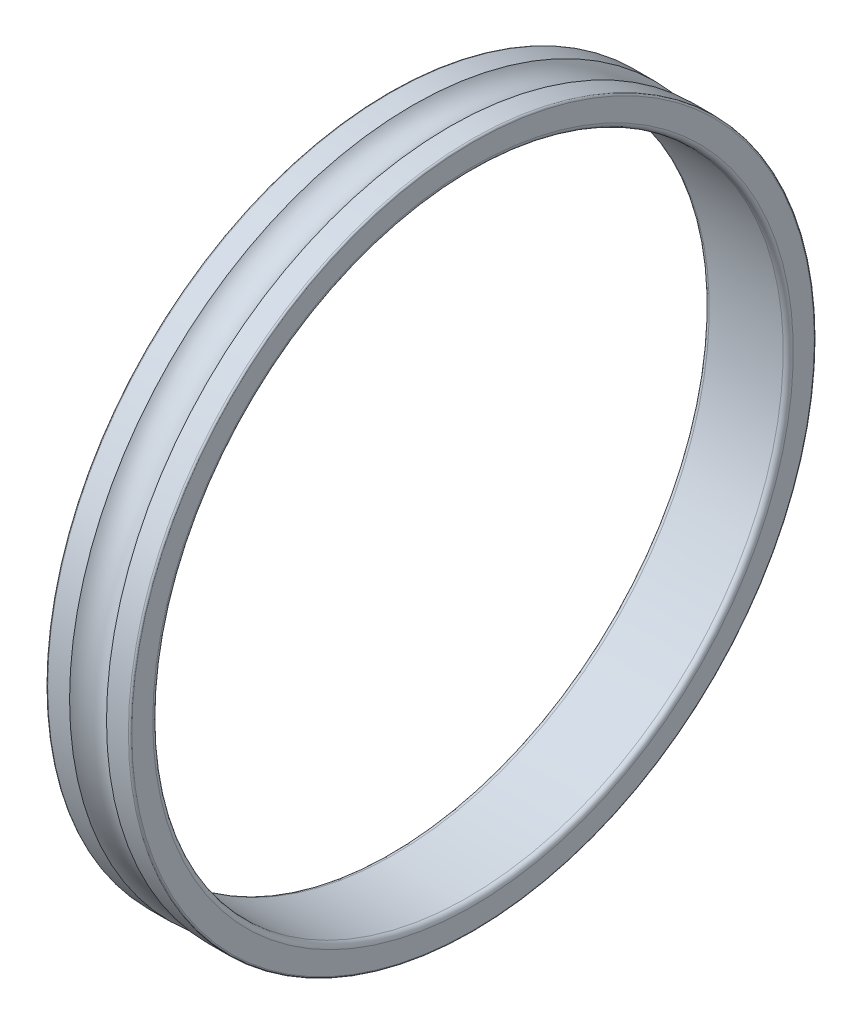
ISO-10303-21;
HEADER;
FILE_DESCRIPTION(('STEP AP214'),'2;1');
FILE_NAME('part.step','',(''),(''),'','','');
FILE_SCHEMA(('AUTOMOTIVE_DESIGN { 1 0 10303 214 1 1 1 1 }'));
ENDSEC;
DATA;
#1=APPLICATION_CONTEXT('core data for automotive mechanical design processes');
#2=APPLICATION_PROTOCOL_DEFINITION('international standard','automotive_design',2000,#1);
#3=PRODUCT_CONTEXT('',#1,'mechanical');
#4=PRODUCT('Part','Part','',(#3));
#5=PRODUCT_RELATED_PRODUCT_CATEGORY('part','',(#4));
#6=PRODUCT_DEFINITION_FORMATION('','',#4);
#7=PRODUCT_DEFINITION_CONTEXT('part definition',#1,'design');
#8=PRODUCT_DEFINITION('design','',#6,#7);
#9=PRODUCT_DEFINITION_SHAPE('','',#8);
#10=(LENGTH_UNIT() NAMED_UNIT(*) SI_UNIT(.MILLI.,.METRE.));
#11=(NAMED_UNIT(*) PLANE_ANGLE_UNIT() SI_UNIT($,.RADIAN.));
#12=(NAMED_UNIT(*) SI_UNIT($,.STERADIAN.) SOLID_ANGLE_UNIT());
#13=UNCERTAINTY_MEASURE_WITH_UNIT(LENGTH_MEASURE(1.E-05),#10,'distance_accuracy_value','');
#14=(GEOMETRIC_REPRESENTATION_CONTEXT(3) GLOBAL_UNCERTAINTY_ASSIGNED_CONTEXT((#13)) GLOBAL_UNIT_ASSIGNED_CONTEXT((#10,
#11,#12)) REPRESENTATION_CONTEXT('',''));
#15=CARTESIAN_POINT('',(0.,0.,0.));
#16=DIRECTION('',(0.,0.,1.));
#17=DIRECTION('',(1.,0.,0.));
#18=AXIS2_PLACEMENT_3D('',#15,#16,#17);
#19=CARTESIAN_POINT('',(0.,40.6,0.));
#20=DIRECTION('',(1.,0.,0.));
#21=DIRECTION('',(0.,0.,-1.));
#22=AXIS2_PLACEMENT_3D('',#19,#20,#21);
#23=PLANE('',#22);
#24=CARTESIAN_POINT('',(0.,0.,0.));
#25=DIRECTION('',(-1.,0.,0.));
#26=DIRECTION('',(0.,0.,1.));
#27=AXIS2_PLACEMENT_3D('',#24,#25,#26);
#28=CIRCLE('',#27,38.1);
#29=CARTESIAN_POINT('',(0.,0.,38.1));
#30=VERTEX_POINT('',#29);
#31=EDGE_CURVE('E9',#30,#30,#28,.T.);
#32=ORIENTED_EDGE('',*,*,#31,.F.);
#33=EDGE_LOOP('',(#32));
#34=FACE_BOUND('',#33,.T.);
#35=CARTESIAN_POINT('',(0.,0.,0.));
#36=DIRECTION('',(-1.,0.,0.));
#37=DIRECTION('',(0.,0.,1.));
#38=AXIS2_PLACEMENT_3D('',#35,#36,#37);
#39=CIRCLE('',#38,40.6);
#40=CARTESIAN_POINT('',(0.,0.,40.6));
#41=VERTEX_POINT('',#40);
#42=EDGE_CURVE('E47',#41,#41,#39,.T.);
#43=ORIENTED_EDGE('',*,*,#42,.T.);
#44=EDGE_LOOP('',(#43));
#45=FACE_BOUND('',#44,.T.);
#46=ADVANCED_FACE('F13',(#34,#45),#23,.F.);
#47=CARTESIAN_POINT('',(0.599999999999885,0.,0.));
#48=DIRECTION('',(-1.,0.,0.));
#49=DIRECTION('',(0.,0.,1.));
#50=AXIS2_PLACEMENT_3D('',#47,#48,#49);
#51=TOROIDAL_SURFACE('',#50,38.0999999999999,0.599999999999886);
#52=CARTESIAN_POINT('',(0.6,0.,0.));
#53=DIRECTION('',(-1.,0.,0.));
#54=DIRECTION('',(0.,0.,1.));
#55=AXIS2_PLACEMENT_3D('',#52,#53,#54);
#56=CIRCLE('',#55,37.5);
#57=CARTESIAN_POINT('',(0.6,0.,37.5));
#58=VERTEX_POINT('',#57);
#59=EDGE_CURVE('E19',#58,#58,#56,.T.);
#60=ORIENTED_EDGE('',*,*,#59,.F.);
#61=EDGE_LOOP('',(#60));
#62=FACE_BOUND('',#61,.T.);
#63=ORIENTED_EDGE('',*,*,#31,.T.);
#64=EDGE_LOOP('',(#63));
#65=FACE_BOUND('',#64,.T.);
#66=ADVANCED_FACE('F96',(#62,#65),#51,.T.);
#67=CARTESIAN_POINT('',(9.4,0.,0.));
#68=DIRECTION('',(-1.,0.,0.));
#69=DIRECTION('',(0.,0.,1.));
#70=AXIS2_PLACEMENT_3D('',#67,#68,#69);
#71=CYLINDRICAL_SURFACE('',#70,37.5);
#72=CARTESIAN_POINT('',(9.4,0.,0.));
#73=DIRECTION('',(-1.,0.,0.));
#74=DIRECTION('',(0.,0.,1.));
#75=AXIS2_PLACEMENT_3D('',#72,#73,#74);
#76=CIRCLE('',#75,37.5);
#77=CARTESIAN_POINT('',(9.4,0.,37.5));
#78=VERTEX_POINT('',#77);
#79=EDGE_CURVE('E23',#78,#78,#76,.T.);
#80=ORIENTED_EDGE('',*,*,#79,.F.);
#81=EDGE_LOOP('',(#80));
#82=FACE_BOUND('',#81,.T.);
#83=ORIENTED_EDGE('',*,*,#59,.T.);
#84=EDGE_LOOP('',(#83));
#85=FACE_BOUND('',#84,.T.);
#86=ADVANCED_FACE('F91',(#82,#85),#71,.F.);
#87=CARTESIAN_POINT('',(9.40000000000006,0.,0.));
#88=DIRECTION('',(-1.,0.,0.));
#89=DIRECTION('',(0.,0.,1.));
#90=AXIS2_PLACEMENT_3D('',#87,#88,#89);
#91=TOROIDAL_SURFACE('',#90,38.0999999999999,0.599999999999935);
#92=CARTESIAN_POINT('',(10.,0.,0.));
#93=DIRECTION('',(-1.,0.,0.));
#94=DIRECTION('',(0.,0.,1.));
#95=AXIS2_PLACEMENT_3D('',#92,#93,#94);
#96=CIRCLE('',#95,38.1);
#97=CARTESIAN_POINT('',(10.,0.,38.1));
#98=VERTEX_POINT('',#97);
#99=EDGE_CURVE('E27',#98,#98,#96,.T.);
#100=ORIENTED_EDGE('',*,*,#99,.F.);
#101=EDGE_LOOP('',(#100));
#102=FACE_BOUND('',#101,.T.);
#103=ORIENTED_EDGE('',*,*,#79,.T.);
#104=EDGE_LOOP('',(#103));
#105=FACE_BOUND('',#104,.T.);
#106=ADVANCED_FACE('F85',(#102,#105),#91,.T.);
#107=CARTESIAN_POINT('',(10.,38.1,0.));
#108=DIRECTION('',(-1.,0.,0.));
#109=DIRECTION('',(0.,0.,1.));
#110=AXIS2_PLACEMENT_3D('',#107,#108,#109);
#111=PLANE('',#110);
#112=CARTESIAN_POINT('',(10.,0.,0.));
#113=DIRECTION('',(-1.,0.,0.));
#114=DIRECTION('',(0.,0.,1.));
#115=AXIS2_PLACEMENT_3D('',#112,#113,#114);
#116=CIRCLE('',#115,40.6);
#117=CARTESIAN_POINT('',(10.,0.,40.6));
#118=VERTEX_POINT('',#117);
#119=EDGE_CURVE('E32',#118,#118,#116,.T.);
#120=ORIENTED_EDGE('',*,*,#119,.F.);
#121=EDGE_LOOP('',(#120));
#122=FACE_BOUND('',#121,.T.);
#123=ORIENTED_EDGE('',*,*,#99,.T.);
#124=EDGE_LOOP('',(#123));
#125=FACE_BOUND('',#124,.T.);
#126=ADVANCED_FACE('F79',(#122,#125),#111,.F.);
#127=CARTESIAN_POINT('',(9.79999999999946,0.,0.));
#128=DIRECTION('',(-1.,0.,0.));
#129=DIRECTION('',(0.,0.,1.));
#130=AXIS2_PLACEMENT_3D('',#127,#128,#129);
#131=TOROIDAL_SURFACE('',#130,40.5999999999995,0.20000000000054);
#132=CARTESIAN_POINT('',(9.8,0.,0.));
#133=DIRECTION('',(-1.,0.,0.));
#134=DIRECTION('',(0.,0.,1.));
#135=AXIS2_PLACEMENT_3D('',#132,#133,#134);
#136=CIRCLE('',#135,40.8);
#137=CARTESIAN_POINT('',(9.8,0.,40.8));
#138=VERTEX_POINT('',#137);
#139=EDGE_CURVE('E35',#138,#138,#136,.T.);
#140=ORIENTED_EDGE('',*,*,#139,.F.);
#141=EDGE_LOOP('',(#140));
#142=FACE_BOUND('',#141,.T.);
#143=ORIENTED_EDGE('',*,*,#119,.T.);
#144=EDGE_LOOP('',(#143));
#145=FACE_BOUND('',#144,.T.);
#146=ADVANCED_FACE('F73',(#142,#145),#131,.T.);
#147=CARTESIAN_POINT('',(9.4,0.,0.));
#148=DIRECTION('',(-1.,0.,0.));
#149=DIRECTION('',(0.,0.,1.));
#150=AXIS2_PLACEMENT_3D('',#147,#148,#149);
#151=CYLINDRICAL_SURFACE('',#150,40.8);
#152=CARTESIAN_POINT('',(7.1971080992978,0.,0.));
#153=DIRECTION('',(-1.,0.,0.));
#154=DIRECTION('',(0.,0.,1.));
#155=AXIS2_PLACEMENT_3D('',#152,#153,#154);
#156=CIRCLE('',#155,40.8);
#157=CARTESIAN_POINT('',(7.1971080992978,0.,40.8));
#158=VERTEX_POINT('',#157);
#159=EDGE_CURVE('E38',#158,#158,#156,.T.);
#160=ORIENTED_EDGE('',*,*,#159,.F.);
#161=EDGE_LOOP('',(#160));
#162=FACE_BOUND('',#161,.T.);
#163=ORIENTED_EDGE('',*,*,#139,.T.);
#164=EDGE_LOOP('',(#163));
#165=FACE_BOUND('',#164,.T.);
#166=ADVANCED_FACE('F67',(#162,#165),#151,.T.);
#167=CARTESIAN_POINT('',(5.,0.,0.));
#168=DIRECTION('',(-1.,0.,0.));
#169=DIRECTION('',(0.,0.,1.));
#170=AXIS2_PLACEMENT_3D('',#167,#168,#169);
#171=TOROIDAL_SURFACE('',#170,42.5,2.778);
#172=CARTESIAN_POINT('',(2.8028919007022,0.,0.));
#173=DIRECTION('',(-1.,0.,0.));
#174=DIRECTION('',(0.,0.,1.));
#175=AXIS2_PLACEMENT_3D('',#172,#173,#174);
#176=CIRCLE('',#175,40.8);
#177=CARTESIAN_POINT('',(2.8028919007022,0.,40.8));
#178=VERTEX_POINT('',#177);
#179=EDGE_CURVE('E41',#178,#178,#176,.T.);
#180=ORIENTED_EDGE('',*,*,#179,.F.);
#181=EDGE_LOOP('',(#180));
#182=FACE_BOUND('',#181,.T.);
#183=ORIENTED_EDGE('',*,*,#159,.T.);
#184=EDGE_LOOP('',(#183));
#185=FACE_BOUND('',#184,.T.);
#186=ADVANCED_FACE('F61',(#182,#185),#171,.F.);
#187=CARTESIAN_POINT('',(9.4,0.,0.));
#188=DIRECTION('',(-1.,0.,0.));
#189=DIRECTION('',(0.,0.,1.));
#190=AXIS2_PLACEMENT_3D('',#187,#188,#189);
#191=CYLINDRICAL_SURFACE('',#190,40.8);
#192=CARTESIAN_POINT('',(0.200000000000001,0.,0.));
#193=DIRECTION('',(-1.,0.,0.));
#194=DIRECTION('',(0.,0.,1.));
#195=AXIS2_PLACEMENT_3D('',#192,#193,#194);
#196=CIRCLE('',#195,40.8);
#197=CARTESIAN_POINT('',(0.200000000000001,0.,40.8));
#198=VERTEX_POINT('',#197);
#199=EDGE_CURVE('E44',#198,#198,#196,.T.);
#200=ORIENTED_EDGE('',*,*,#199,.F.);
#201=EDGE_LOOP('',(#200));
#202=FACE_BOUND('',#201,.T.);
#203=ORIENTED_EDGE('',*,*,#179,.T.);
#204=EDGE_LOOP('',(#203));
#205=FACE_BOUND('',#204,.T.);
#206=ADVANCED_FACE('F55',(#202,#205),#191,.T.);
#207=CARTESIAN_POINT('',(0.200000000000523,0.,0.));
#208=DIRECTION('',(-1.,0.,0.));
#209=DIRECTION('',(0.,0.,1.));
#210=AXIS2_PLACEMENT_3D('',#207,#208,#209);
#211=TOROIDAL_SURFACE('',#210,40.5999999999995,0.200000000000521);
#212=ORIENTED_EDGE('',*,*,#42,.F.);
#213=EDGE_LOOP('',(#212));
#214=FACE_BOUND('',#213,.T.);
#215=ORIENTED_EDGE('',*,*,#199,.T.);
#216=EDGE_LOOP('',(#215));
#217=FACE_BOUND('',#216,.T.);
#218=ADVANCED_FACE('F52',(#214,#217),#211,.T.);
#219=CLOSED_SHELL('',(#46,#66,#86,#106,#126,#146,#166,#186,#206,#218));
#220=MANIFOLD_SOLID_BREP('B1',#219);
#221=ADVANCED_BREP_SHAPE_REPRESENTATION('',(#18,#220),#14);
#222=SHAPE_DEFINITION_REPRESENTATION(#9,#221);
ENDSEC;
END-ISO-10303-21;
